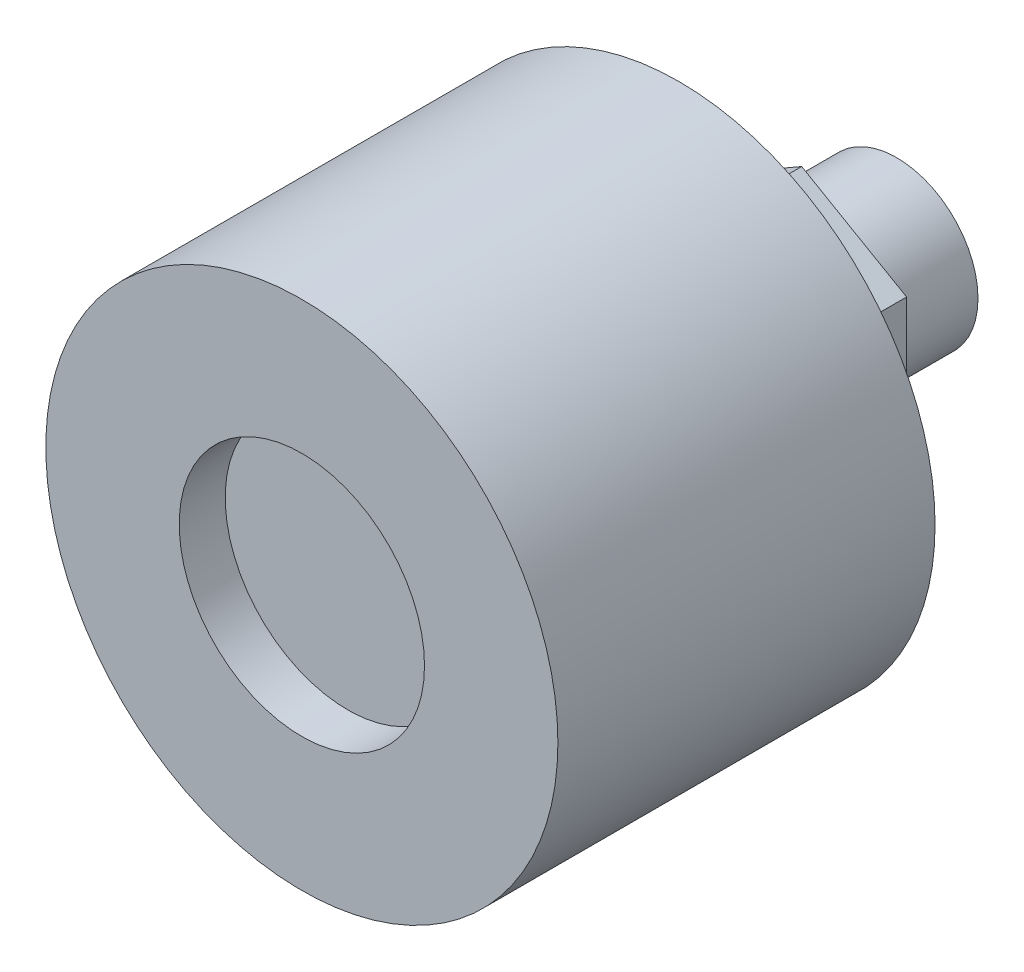
ISO-10303-21;
HEADER;
FILE_DESCRIPTION(('STEP AP214'),'2;1');
FILE_NAME('part.step','',(''),(''),'','','');
FILE_SCHEMA(('AUTOMOTIVE_DESIGN { 1 0 10303 214 1 1 1 1 }'));
ENDSEC;
DATA;
#1=APPLICATION_CONTEXT('core data for automotive mechanical design processes');
#2=APPLICATION_PROTOCOL_DEFINITION('international standard','automotive_design',2000,#1);
#3=PRODUCT_CONTEXT('',#1,'mechanical');
#4=PRODUCT('Part','Part','',(#3));
#5=PRODUCT_RELATED_PRODUCT_CATEGORY('part','',(#4));
#6=PRODUCT_DEFINITION_FORMATION('','',#4);
#7=PRODUCT_DEFINITION_CONTEXT('part definition',#1,'design');
#8=PRODUCT_DEFINITION('design','',#6,#7);
#9=PRODUCT_DEFINITION_SHAPE('','',#8);
#10=(LENGTH_UNIT() NAMED_UNIT(*) SI_UNIT(.MILLI.,.METRE.));
#11=(NAMED_UNIT(*) PLANE_ANGLE_UNIT() SI_UNIT($,.RADIAN.));
#12=(NAMED_UNIT(*) SI_UNIT($,.STERADIAN.) SOLID_ANGLE_UNIT());
#13=UNCERTAINTY_MEASURE_WITH_UNIT(LENGTH_MEASURE(1.E-05),#10,'distance_accuracy_value','');
#14=(GEOMETRIC_REPRESENTATION_CONTEXT(3) GLOBAL_UNCERTAINTY_ASSIGNED_CONTEXT((#13)) GLOBAL_UNIT_ASSIGNED_CONTEXT((#10,
#11,#12)) REPRESENTATION_CONTEXT('',''));
#15=CARTESIAN_POINT('',(0.,0.,0.));
#16=DIRECTION('',(0.,0.,1.));
#17=DIRECTION('',(1.,0.,0.));
#18=AXIS2_PLACEMENT_3D('',#15,#16,#17);
#19=CARTESIAN_POINT('',(0.,0.,-0.5));
#20=DIRECTION('',(0.,0.,1.));
#21=DIRECTION('',(1.,0.,0.));
#22=AXIS2_PLACEMENT_3D('',#19,#20,#21);
#23=CYLINDRICAL_SURFACE('',#22,8.35);
#24=CARTESIAN_POINT('',(0.,0.,1.));
#25=DIRECTION('',(0.,0.,1.));
#26=DIRECTION('',(1.,0.,0.));
#27=AXIS2_PLACEMENT_3D('',#24,#25,#26);
#28=CIRCLE('',#27,8.35);
#29=CARTESIAN_POINT('',(8.35,0.,1.));
#30=VERTEX_POINT('',#29);
#31=EDGE_CURVE('E129',#30,#30,#28,.T.);
#32=ORIENTED_EDGE('',*,*,#31,.F.);
#33=EDGE_LOOP('',(#32));
#34=FACE_BOUND('',#33,.T.);
#35=CARTESIAN_POINT('',(0.,0.,-11.3));
#36=DIRECTION('',(0.,0.,-1.));
#37=DIRECTION('',(-1.,0.,0.));
#38=AXIS2_PLACEMENT_3D('',#35,#36,#37);
#39=CIRCLE('',#38,8.35);
#40=CARTESIAN_POINT('',(-8.35,0.,-11.3));
#41=VERTEX_POINT('',#40);
#42=EDGE_CURVE('E116',#41,#41,#39,.T.);
#43=ORIENTED_EDGE('',*,*,#42,.F.);
#44=EDGE_LOOP('',(#43));
#45=FACE_BOUND('',#44,.T.);
#46=ADVANCED_FACE('F39',(#34,#45),#23,.T.);
#47=CARTESIAN_POINT('',(0.,0.,-0.5));
#48=DIRECTION('',(0.,0.,1.));
#49=DIRECTION('',(1.,0.,0.));
#50=AXIS2_PLACEMENT_3D('',#47,#48,#49);
#51=CYLINDRICAL_SURFACE('',#50,4.);
#52=CARTESIAN_POINT('',(0.,0.,-0.5));
#53=DIRECTION('',(0.,0.,1.));
#54=DIRECTION('',(1.,0.,0.));
#55=AXIS2_PLACEMENT_3D('',#52,#53,#54);
#56=CIRCLE('',#55,4.);
#57=CARTESIAN_POINT('',(4.,0.,-0.5));
#58=VERTEX_POINT('',#57);
#59=EDGE_CURVE('E42',#58,#58,#56,.T.);
#60=ORIENTED_EDGE('',*,*,#59,.F.);
#61=EDGE_LOOP('',(#60));
#62=FACE_BOUND('',#61,.T.);
#63=CARTESIAN_POINT('',(0.,0.,1.));
#64=DIRECTION('',(0.,0.,1.));
#65=DIRECTION('',(1.,0.,0.));
#66=AXIS2_PLACEMENT_3D('',#63,#64,#65);
#67=CIRCLE('',#66,4.);
#68=CARTESIAN_POINT('',(4.,0.,1.));
#69=VERTEX_POINT('',#68);
#70=EDGE_CURVE('E121',#69,#69,#67,.T.);
#71=ORIENTED_EDGE('',*,*,#70,.T.);
#72=EDGE_LOOP('',(#71));
#73=FACE_BOUND('',#72,.T.);
#74=ADVANCED_FACE('F140',(#62,#73),#51,.F.);
#75=CARTESIAN_POINT('',(0.,0.,1.));
#76=DIRECTION('',(0.,0.,1.));
#77=DIRECTION('',(1.,0.,0.));
#78=AXIS2_PLACEMENT_3D('',#75,#76,#77);
#79=PLANE('',#78);
#80=ORIENTED_EDGE('',*,*,#31,.T.);
#81=EDGE_LOOP('',(#80));
#82=FACE_BOUND('',#81,.T.);
#83=ORIENTED_EDGE('',*,*,#70,.F.);
#84=EDGE_LOOP('',(#83));
#85=FACE_BOUND('',#84,.T.);
#86=ADVANCED_FACE('F143',(#82,#85),#79,.T.);
#87=CARTESIAN_POINT('',(0.,0.,-0.5));
#88=DIRECTION('',(0.,0.,-1.));
#89=DIRECTION('',(-1.,0.,0.));
#90=AXIS2_PLACEMENT_3D('',#87,#88,#89);
#91=PLANE('',#90);
#92=ORIENTED_EDGE('',*,*,#59,.T.);
#93=EDGE_LOOP('',(#92));
#94=FACE_BOUND('',#93,.T.);
#95=ADVANCED_FACE('F138',(#94),#91,.F.);
#96=CARTESIAN_POINT('',(0.,0.,-11.3));
#97=DIRECTION('',(0.,0.,-1.));
#98=DIRECTION('',(-1.,0.,0.));
#99=AXIS2_PLACEMENT_3D('',#96,#97,#98);
#100=PLANE('',#99);
#101=DIRECTION('',(0.866025403784442,0.499999999999995,0.));
#102=VECTOR('',#101,1.);
#103=CARTESIAN_POINT('',(-3.42080034494851,1.97500000000004,-11.3));
#104=LINE('',#103,#102);
#105=CARTESIAN_POINT('',(-3.42080034494851,1.97500000000004,-11.3));
#106=VERTEX_POINT('',#105);
#107=CARTESIAN_POINT('',(0.,3.95,-11.3));
#108=VERTEX_POINT('',#107);
#109=EDGE_CURVE('E55',#106,#108,#104,.T.);
#110=ORIENTED_EDGE('',*,*,#109,.F.);
#111=DIRECTION('',(0.,1.,0.));
#112=VECTOR('',#111,1.);
#113=CARTESIAN_POINT('',(-3.42080034494855,-1.97499999999997,-11.3));
#114=LINE('',#113,#112);
#115=CARTESIAN_POINT('',(-3.42080034494855,-1.97499999999997,-11.3));
#116=VERTEX_POINT('',#115);
#117=EDGE_CURVE('E59',#116,#106,#114,.T.);
#118=ORIENTED_EDGE('',*,*,#117,.F.);
#119=DIRECTION('',(-0.866025403784436,0.500000000000004,0.));
#120=VECTOR('',#119,1.);
#121=CARTESIAN_POINT('',(0.,-3.95,-11.3));
#122=LINE('',#121,#120);
#123=CARTESIAN_POINT('',(0.,-3.95,-11.3));
#124=VERTEX_POINT('',#123);
#125=EDGE_CURVE('E243',#124,#116,#122,.T.);
#126=ORIENTED_EDGE('',*,*,#125,.F.);
#127=DIRECTION('',(-0.86602540378444,-0.499999999999998,0.));
#128=VECTOR('',#127,1.);
#129=CARTESIAN_POINT('',(3.42080034494852,-1.97500000000002,-11.3));
#130=LINE('',#129,#128);
#131=CARTESIAN_POINT('',(3.42080034494852,-1.97500000000002,-11.3));
#132=VERTEX_POINT('',#131);
#133=EDGE_CURVE('E239',#132,#124,#130,.T.);
#134=ORIENTED_EDGE('',*,*,#133,.F.);
#135=DIRECTION('',(0.,-1.,0.));
#136=VECTOR('',#135,1.);
#137=CARTESIAN_POINT('',(3.42080034494854,1.97499999999999,-11.3));
#138=LINE('',#137,#136);
#139=CARTESIAN_POINT('',(3.42080034494854,1.97499999999999,-11.3));
#140=VERTEX_POINT('',#139);
#141=EDGE_CURVE('E235',#140,#132,#138,.T.);
#142=ORIENTED_EDGE('',*,*,#141,.F.);
#143=DIRECTION('',(0.866025403784438,-0.500000000000001,0.));
#144=VECTOR('',#143,1.);
#145=CARTESIAN_POINT('',(0.,3.95,-11.3));
#146=LINE('',#145,#144);
#147=EDGE_CURVE('E232',#108,#140,#146,.T.);
#148=ORIENTED_EDGE('',*,*,#147,.F.);
#149=EDGE_LOOP('',(#110,#118,#126,#134,#142,#148));
#150=FACE_BOUND('',#149,.T.);
#151=ORIENTED_EDGE('',*,*,#42,.T.);
#152=EDGE_LOOP('',(#151));
#153=FACE_BOUND('',#152,.T.);
#154=ADVANCED_FACE('F151',(#150,#153),#100,.T.);
#155=CARTESIAN_POINT('',(-3.42080034494851,1.97500000000004,-15.3));
#156=DIRECTION('',(0.499999999999995,-0.866025403784442,0.));
#157=DIRECTION('',(0.866025403784442,0.499999999999995,0.));
#158=AXIS2_PLACEMENT_3D('',#155,#156,#157);
#159=PLANE('',#158);
#160=ORIENTED_EDGE('',*,*,#109,.T.);
#161=DIRECTION('',(0.,0.,1.));
#162=VECTOR('',#161,1.);
#163=CARTESIAN_POINT('',(0.,3.95,-15.3));
#164=LINE('',#163,#162);
#165=CARTESIAN_POINT('',(0.,3.95,-15.3));
#166=VERTEX_POINT('',#165);
#167=EDGE_CURVE('E96',#166,#108,#164,.T.);
#168=ORIENTED_EDGE('',*,*,#167,.F.);
#169=DIRECTION('',(0.866025403784442,0.499999999999995,0.));
#170=VECTOR('',#169,1.);
#171=CARTESIAN_POINT('',(-3.42080034494851,1.97500000000004,-15.3));
#172=LINE('',#171,#170);
#173=CARTESIAN_POINT('',(-3.42080034494851,1.97500000000004,-15.3));
#174=VERTEX_POINT('',#173);
#175=EDGE_CURVE('E103',#174,#166,#172,.T.);
#176=ORIENTED_EDGE('',*,*,#175,.F.);
#177=DIRECTION('',(0.,0.,1.));
#178=VECTOR('',#177,1.);
#179=CARTESIAN_POINT('',(-3.42080034494851,1.97500000000004,-15.3));
#180=LINE('',#179,#178);
#181=EDGE_CURVE('E229',#174,#106,#180,.T.);
#182=ORIENTED_EDGE('',*,*,#181,.T.);
#183=EDGE_LOOP('',(#160,#168,#176,#182));
#184=FACE_BOUND('',#183,.T.);
#185=ADVANCED_FACE('F114',(#184),#159,.F.);
#186=CARTESIAN_POINT('',(0.,3.95,-15.3));
#187=DIRECTION('',(-0.500000000000001,-0.866025403784438,0.));
#188=DIRECTION('',(0.866025403784438,-0.500000000000001,0.));
#189=AXIS2_PLACEMENT_3D('',#186,#187,#188);
#190=PLANE('',#189);
#191=ORIENTED_EDGE('',*,*,#147,.T.);
#192=DIRECTION('',(0.,0.,1.));
#193=VECTOR('',#192,1.);
#194=CARTESIAN_POINT('',(3.42080034494854,1.97499999999999,-15.3));
#195=LINE('',#194,#193);
#196=CARTESIAN_POINT('',(3.42080034494854,1.97499999999999,-15.3));
#197=VERTEX_POINT('',#196);
#198=EDGE_CURVE('E98',#197,#140,#195,.T.);
#199=ORIENTED_EDGE('',*,*,#198,.F.);
#200=DIRECTION('',(0.866025403784438,-0.500000000000001,0.));
#201=VECTOR('',#200,1.);
#202=CARTESIAN_POINT('',(0.,3.95,-15.3));
#203=LINE('',#202,#201);
#204=EDGE_CURVE('E91',#166,#197,#203,.T.);
#205=ORIENTED_EDGE('',*,*,#204,.F.);
#206=ORIENTED_EDGE('',*,*,#167,.T.);
#207=EDGE_LOOP('',(#191,#199,#205,#206));
#208=FACE_BOUND('',#207,.T.);
#209=ADVANCED_FACE('F94',(#208),#190,.F.);
#210=CARTESIAN_POINT('',(3.42080034494854,1.97499999999999,-15.3));
#211=DIRECTION('',(-1.,0.,0.));
#212=DIRECTION('',(0.,-1.,0.));
#213=AXIS2_PLACEMENT_3D('',#210,#211,#212);
#214=PLANE('',#213);
#215=ORIENTED_EDGE('',*,*,#141,.T.);
#216=DIRECTION('',(0.,0.,1.));
#217=VECTOR('',#216,1.);
#218=CARTESIAN_POINT('',(3.42080034494852,-1.97500000000002,-15.3));
#219=LINE('',#218,#217);
#220=CARTESIAN_POINT('',(3.42080034494852,-1.97500000000002,-15.3));
#221=VERTEX_POINT('',#220);
#222=EDGE_CURVE('E123',#221,#132,#219,.T.);
#223=ORIENTED_EDGE('',*,*,#222,.F.);
#224=DIRECTION('',(0.,-1.,0.));
#225=VECTOR('',#224,1.);
#226=CARTESIAN_POINT('',(3.42080034494854,1.97499999999999,-15.3));
#227=LINE('',#226,#225);
#228=EDGE_CURVE('E102',#197,#221,#227,.T.);
#229=ORIENTED_EDGE('',*,*,#228,.F.);
#230=ORIENTED_EDGE('',*,*,#198,.T.);
#231=EDGE_LOOP('',(#215,#223,#229,#230));
#232=FACE_BOUND('',#231,.T.);
#233=ADVANCED_FACE('F169',(#232),#214,.F.);
#234=CARTESIAN_POINT('',(3.42080034494852,-1.97500000000002,-15.3));
#235=DIRECTION('',(-0.499999999999998,0.86602540378444,0.));
#236=DIRECTION('',(-0.86602540378444,-0.499999999999998,0.));
#237=AXIS2_PLACEMENT_3D('',#234,#235,#236);
#238=PLANE('',#237);
#239=ORIENTED_EDGE('',*,*,#133,.T.);
#240=DIRECTION('',(0.,0.,1.));
#241=VECTOR('',#240,1.);
#242=CARTESIAN_POINT('',(0.,-3.95,-15.3));
#243=LINE('',#242,#241);
#244=CARTESIAN_POINT('',(0.,-3.95,-15.3));
#245=VERTEX_POINT('',#244);
#246=EDGE_CURVE('E254',#245,#124,#243,.T.);
#247=ORIENTED_EDGE('',*,*,#246,.F.);
#248=DIRECTION('',(-0.86602540378444,-0.499999999999998,0.));
#249=VECTOR('',#248,1.);
#250=CARTESIAN_POINT('',(3.42080034494852,-1.97500000000002,-15.3));
#251=LINE('',#250,#249);
#252=EDGE_CURVE('E221',#221,#245,#251,.T.);
#253=ORIENTED_EDGE('',*,*,#252,.F.);
#254=ORIENTED_EDGE('',*,*,#222,.T.);
#255=EDGE_LOOP('',(#239,#247,#253,#254));
#256=FACE_BOUND('',#255,.T.);
#257=ADVANCED_FACE('F172',(#256),#238,.F.);
#258=CARTESIAN_POINT('',(0.,-3.95,-15.3));
#259=DIRECTION('',(0.500000000000004,0.866025403784436,0.));
#260=DIRECTION('',(-0.866025403784436,0.500000000000004,0.));
#261=AXIS2_PLACEMENT_3D('',#258,#259,#260);
#262=PLANE('',#261);
#263=ORIENTED_EDGE('',*,*,#125,.T.);
#264=DIRECTION('',(0.,0.,1.));
#265=VECTOR('',#264,1.);
#266=CARTESIAN_POINT('',(-3.42080034494855,-1.97499999999997,-15.3));
#267=LINE('',#266,#265);
#268=CARTESIAN_POINT('',(-3.42080034494855,-1.97499999999997,-15.3));
#269=VERTEX_POINT('',#268);
#270=EDGE_CURVE('E250',#269,#116,#267,.T.);
#271=ORIENTED_EDGE('',*,*,#270,.F.);
#272=DIRECTION('',(-0.866025403784436,0.500000000000004,0.));
#273=VECTOR('',#272,1.);
#274=CARTESIAN_POINT('',(0.,-3.95,-15.3));
#275=LINE('',#274,#273);
#276=EDGE_CURVE('E224',#245,#269,#275,.T.);
#277=ORIENTED_EDGE('',*,*,#276,.F.);
#278=ORIENTED_EDGE('',*,*,#246,.T.);
#279=EDGE_LOOP('',(#263,#271,#277,#278));
#280=FACE_BOUND('',#279,.T.);
#281=ADVANCED_FACE('F176',(#280),#262,.F.);
#282=CARTESIAN_POINT('',(-3.42080034494855,-1.97499999999997,-15.3));
#283=DIRECTION('',(1.,0.,0.));
#284=DIRECTION('',(0.,1.,0.));
#285=AXIS2_PLACEMENT_3D('',#282,#283,#284);
#286=PLANE('',#285);
#287=ORIENTED_EDGE('',*,*,#117,.T.);
#288=ORIENTED_EDGE('',*,*,#181,.F.);
#289=DIRECTION('',(0.,1.,0.));
#290=VECTOR('',#289,1.);
#291=CARTESIAN_POINT('',(-3.42080034494855,-1.97499999999997,-15.3));
#292=LINE('',#291,#290);
#293=EDGE_CURVE('E108',#269,#174,#292,.T.);
#294=ORIENTED_EDGE('',*,*,#293,.F.);
#295=ORIENTED_EDGE('',*,*,#270,.T.);
#296=EDGE_LOOP('',(#287,#288,#294,#295));
#297=FACE_BOUND('',#296,.T.);
#298=ADVANCED_FACE('F180',(#297),#286,.F.);
#299=CARTESIAN_POINT('',(0.,0.,-15.3));
#300=DIRECTION('',(0.,0.,-1.));
#301=DIRECTION('',(-1.,0.,0.));
#302=AXIS2_PLACEMENT_3D('',#299,#300,#301);
#303=PLANE('',#302);
#304=CARTESIAN_POINT('',(0.,0.,-15.3));
#305=DIRECTION('',(0.,0.,-1.));
#306=DIRECTION('',(-1.,0.,0.));
#307=AXIS2_PLACEMENT_3D('',#304,#305,#306);
#308=CIRCLE('',#307,2.65);
#309=CARTESIAN_POINT('',(2.65,0.,-15.3));
#310=VERTEX_POINT('',#309);
#311=EDGE_CURVE('E11',#310,#310,#308,.T.);
#312=ORIENTED_EDGE('',*,*,#311,.F.);
#313=EDGE_LOOP('',(#312));
#314=FACE_BOUND('',#313,.T.);
#315=ORIENTED_EDGE('',*,*,#175,.T.);
#316=ORIENTED_EDGE('',*,*,#204,.T.);
#317=ORIENTED_EDGE('',*,*,#228,.T.);
#318=ORIENTED_EDGE('',*,*,#252,.T.);
#319=ORIENTED_EDGE('',*,*,#276,.T.);
#320=ORIENTED_EDGE('',*,*,#293,.T.);
#321=EDGE_LOOP('',(#315,#316,#317,#318,#319,#320));
#322=FACE_BOUND('',#321,.T.);
#323=ADVANCED_FACE('F106',(#314,#322),#303,.T.);
#324=CARTESIAN_POINT('',(0.,0.,-18.4));
#325=DIRECTION('',(0.,0.,1.));
#326=DIRECTION('',(1.,0.,0.));
#327=AXIS2_PLACEMENT_3D('',#324,#325,#326);
#328=CYLINDRICAL_SURFACE('',#327,2.65);
#329=CARTESIAN_POINT('',(0.,0.,-18.4));
#330=DIRECTION('',(0.,0.,-1.));
#331=DIRECTION('',(-1.,0.,0.));
#332=AXIS2_PLACEMENT_3D('',#329,#330,#331);
#333=CIRCLE('',#332,2.65);
#334=CARTESIAN_POINT('',(2.65,0.,-18.4));
#335=VERTEX_POINT('',#334);
#336=EDGE_CURVE('E209',#335,#335,#333,.T.);
#337=CARTESIAN_POINT('',(2.65,0.,-18.4));
#338=CARTESIAN_POINT('',(2.65,0.,-18.3677083333333));
#339=CARTESIAN_POINT('',(2.65,0.,-18.3354166666667));
#340=CARTESIAN_POINT('',(2.65,0.,-18.2708333333333));
#341=CARTESIAN_POINT('',(2.65,0.,-18.2385416666667));
#342=CARTESIAN_POINT('',(2.65,0.,-18.1739583333333));
#343=CARTESIAN_POINT('',(2.65,0.,-18.1416666666667));
#344=CARTESIAN_POINT('',(2.65,0.,-18.0770833333333));
#345=CARTESIAN_POINT('',(2.65,0.,-18.0447916666667));
#346=CARTESIAN_POINT('',(2.65,0.,-17.9802083333333));
#347=CARTESIAN_POINT('',(2.65,0.,-17.9479166666667));
#348=CARTESIAN_POINT('',(2.65,0.,-17.8833333333333));
#349=CARTESIAN_POINT('',(2.65,0.,-17.8510416666667));
#350=CARTESIAN_POINT('',(2.65,0.,-17.7864583333333));
#351=CARTESIAN_POINT('',(2.65,0.,-17.7541666666667));
#352=CARTESIAN_POINT('',(2.65,0.,-17.6895833333333));
#353=CARTESIAN_POINT('',(2.65,0.,-17.6572916666667));
#354=CARTESIAN_POINT('',(2.65,0.,-17.5927083333333));
#355=CARTESIAN_POINT('',(2.65,0.,-17.5604166666667));
#356=CARTESIAN_POINT('',(2.65,0.,-17.4958333333333));
#357=CARTESIAN_POINT('',(2.65,0.,-17.4635416666667));
#358=CARTESIAN_POINT('',(2.65,0.,-17.3989583333333));
#359=CARTESIAN_POINT('',(2.65,0.,-17.3666666666667));
#360=CARTESIAN_POINT('',(2.65,0.,-17.3020833333333));
#361=CARTESIAN_POINT('',(2.65,0.,-17.2697916666667));
#362=CARTESIAN_POINT('',(2.65,0.,-17.2052083333333));
#363=CARTESIAN_POINT('',(2.65,0.,-17.1729166666667));
#364=CARTESIAN_POINT('',(2.65,0.,-17.1083333333333));
#365=CARTESIAN_POINT('',(2.65,0.,-17.0760416666667));
#366=CARTESIAN_POINT('',(2.65,0.,-17.0114583333333));
#367=CARTESIAN_POINT('',(2.65,0.,-16.9791666666667));
#368=CARTESIAN_POINT('',(2.65,0.,-16.9145833333333));
#369=CARTESIAN_POINT('',(2.65,0.,-16.8822916666667));
#370=CARTESIAN_POINT('',(2.65,0.,-16.8177083333333));
#371=CARTESIAN_POINT('',(2.65,0.,-16.7854166666667));
#372=CARTESIAN_POINT('',(2.65,0.,-16.7208333333333));
#373=CARTESIAN_POINT('',(2.65,0.,-16.6885416666667));
#374=CARTESIAN_POINT('',(2.65,0.,-16.6239583333333));
#375=CARTESIAN_POINT('',(2.65,0.,-16.5916666666667));
#376=CARTESIAN_POINT('',(2.65,0.,-16.5270833333333));
#377=CARTESIAN_POINT('',(2.65,0.,-16.4947916666667));
#378=CARTESIAN_POINT('',(2.65,0.,-16.4302083333333));
#379=CARTESIAN_POINT('',(2.65,0.,-16.3979166666667));
#380=CARTESIAN_POINT('',(2.65,0.,-16.3333333333333));
#381=CARTESIAN_POINT('',(2.65,0.,-16.3010416666667));
#382=CARTESIAN_POINT('',(2.65,0.,-16.2364583333333));
#383=CARTESIAN_POINT('',(2.65,0.,-16.2041666666667));
#384=CARTESIAN_POINT('',(2.65,0.,-16.1395833333333));
#385=CARTESIAN_POINT('',(2.65,0.,-16.1072916666667));
#386=CARTESIAN_POINT('',(2.65,0.,-16.0427083333333));
#387=CARTESIAN_POINT('',(2.65,0.,-16.0104166666667));
#388=CARTESIAN_POINT('',(2.65,0.,-15.9458333333333));
#389=CARTESIAN_POINT('',(2.65,0.,-15.9135416666667));
#390=CARTESIAN_POINT('',(2.65,0.,-15.8489583333333));
#391=CARTESIAN_POINT('',(2.65,0.,-15.8166666666667));
#392=CARTESIAN_POINT('',(2.65,0.,-15.7520833333333));
#393=CARTESIAN_POINT('',(2.65,0.,-15.7197916666667));
#394=CARTESIAN_POINT('',(2.65,0.,-15.6552083333333));
#395=CARTESIAN_POINT('',(2.65,0.,-15.6229166666667));
#396=CARTESIAN_POINT('',(2.65,0.,-15.5583333333333));
#397=CARTESIAN_POINT('',(2.65,0.,-15.5260416666667));
#398=CARTESIAN_POINT('',(2.65,0.,-15.4614583333333));
#399=CARTESIAN_POINT('',(2.65,0.,-15.4291666666667));
#400=CARTESIAN_POINT('',(2.65,0.,-15.3645833333333));
#401=CARTESIAN_POINT('',(2.65,0.,-15.3322916666667));
#402=CARTESIAN_POINT('',(2.65,0.,-15.3));
#403=B_SPLINE_CURVE_WITH_KNOTS('',3,(#337,#338,#339,#340,#341,#342,#343,#344,#345,#346,#347,
#348,#349,#350,#351,#352,#353,#354,#355,#356,#357,#358,#359,#360,#361,#362,#363,#364,#365,#366,
#367,#368,#369,#370,#371,#372,#373,#374,#375,#376,#377,#378,#379,#380,#381,#382,#383,#384,#385,
#386,#387,#388,#389,#390,#391,#392,#393,#394,#395,#396,#397,#398,#399,#400,#401,#402),
.UNSPECIFIED.,.F.,.F.,(4,2,2,2,2,2,2,2,2,2,2,2,2,2,2,2,2,2,2,2,2,2,2,2,2,2,2,2,2,2,2,2,4),(0.,
0.0968749999999997,0.193749999999999,0.290624999999999,0.387499999999999,0.484374999999999,
0.581249999999998,0.678124999999998,0.774999999999998,0.871874999999998,0.968749999999997,
1.065625,1.1625,1.259375,1.35625,1.453125,1.55,1.646875,1.74375,1.840625,1.9375,2.034375,
2.13125,2.228125,2.325,2.421875,2.51875,2.615625,2.7125,2.809375,2.90625,3.003125,3.1),.UNSPECIFIED.);
#404=EDGE_CURVE('BSEAM187',#335,#310,#403,.T.);
#405=ORIENTED_EDGE('',*,*,#336,.F.);
#406=ORIENTED_EDGE('',*,*,#311,.T.);
#407=ORIENTED_EDGE('',*,*,#404,.T.);
#408=ORIENTED_EDGE('',*,*,#404,.F.);
#409=EDGE_LOOP('',(#405,#407,#406,#408));
#410=FACE_BOUND('',#409,.T.);
#411=ADVANCED_FACE('F187',(#410),#328,.T.);
#412=CARTESIAN_POINT('',(0.,0.,-18.4));
#413=DIRECTION('',(0.,0.,-1.));
#414=DIRECTION('',(-1.,0.,0.));
#415=AXIS2_PLACEMENT_3D('',#412,#413,#414);
#416=PLANE('',#415);
#417=CARTESIAN_POINT('',(0.,0.,-18.4));
#418=DIRECTION('',(0.,0.,-1.));
#419=DIRECTION('',(-1.,0.,0.));
#420=AXIS2_PLACEMENT_3D('',#417,#418,#419);
#421=CIRCLE('',#420,0.244312337230213);
#422=CARTESIAN_POINT('',(-0.244312337230213,0.,-18.4));
#423=VERTEX_POINT('',#422);
#424=EDGE_CURVE('E210',#423,#423,#421,.T.);
#425=ORIENTED_EDGE('',*,*,#424,.F.);
#426=EDGE_LOOP('',(#425));
#427=FACE_BOUND('',#426,.T.);
#428=ORIENTED_EDGE('',*,*,#336,.T.);
#429=EDGE_LOOP('',(#428));
#430=FACE_BOUND('',#429,.T.);
#431=ADVANCED_FACE('F191',(#427,#430),#416,.T.);
#432=CARTESIAN_POINT('',(0.,0.,-16.4));
#433=DIRECTION('',(0.,0.,-1.));
#434=DIRECTION('',(-1.,0.,0.));
#435=AXIS2_PLACEMENT_3D('',#432,#433,#434);
#436=CYLINDRICAL_SURFACE('',#435,0.244312337230213);
#437=CARTESIAN_POINT('',(0.,0.,-16.4));
#438=DIRECTION('',(0.,0.,-1.));
#439=DIRECTION('',(-1.,0.,0.));
#440=AXIS2_PLACEMENT_3D('',#437,#438,#439);
#441=CIRCLE('',#440,0.244312337230213);
#442=CARTESIAN_POINT('',(-0.244312337230213,0.,-16.4));
#443=VERTEX_POINT('',#442);
#444=EDGE_CURVE('E207',#443,#443,#441,.T.);
#445=ORIENTED_EDGE('',*,*,#444,.F.);
#446=EDGE_LOOP('',(#445));
#447=FACE_BOUND('',#446,.T.);
#448=ORIENTED_EDGE('',*,*,#424,.T.);
#449=EDGE_LOOP('',(#448));
#450=FACE_BOUND('',#449,.T.);
#451=ADVANCED_FACE('F195',(#447,#450),#436,.F.);
#452=CARTESIAN_POINT('',(0.,0.,-16.4));
#453=DIRECTION('',(0.,0.,-1.));
#454=DIRECTION('',(-1.,0.,0.));
#455=AXIS2_PLACEMENT_3D('',#452,#453,#454);
#456=PLANE('',#455);
#457=ORIENTED_EDGE('',*,*,#444,.T.);
#458=EDGE_LOOP('',(#457));
#459=FACE_BOUND('',#458,.T.);
#460=ADVANCED_FACE('F199',(#459),#456,.T.);
#461=CLOSED_SHELL('',(#46,#74,#86,#95,#154,#185,#209,#233,#257,#281,#298,#323,#411,#431,#451,#460));
#462=MANIFOLD_SOLID_BREP('B2',#461);
#463=ADVANCED_BREP_SHAPE_REPRESENTATION('',(#18,#462),#14);
#464=SHAPE_DEFINITION_REPRESENTATION(#9,#463);
ENDSEC;
END-ISO-10303-21;
